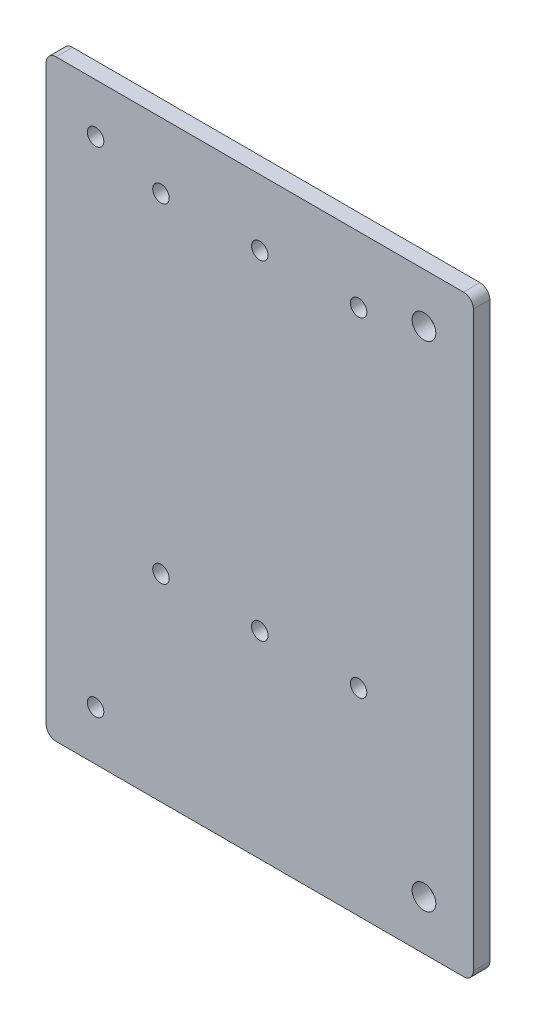
ISO-10303-21;
HEADER;
FILE_DESCRIPTION(('STEP AP214'),'2;1');
FILE_NAME('part.step','',(''),(''),'','','');
FILE_SCHEMA(('AUTOMOTIVE_DESIGN { 1 0 10303 214 1 1 1 1 }'));
ENDSEC;
DATA;
#1=APPLICATION_CONTEXT('core data for automotive mechanical design processes');
#2=APPLICATION_PROTOCOL_DEFINITION('international standard','automotive_design',2000,#1);
#3=PRODUCT_CONTEXT('',#1,'mechanical');
#4=PRODUCT('Part','Part','',(#3));
#5=PRODUCT_RELATED_PRODUCT_CATEGORY('part','',(#4));
#6=PRODUCT_DEFINITION_FORMATION('','',#4);
#7=PRODUCT_DEFINITION_CONTEXT('part definition',#1,'design');
#8=PRODUCT_DEFINITION('design','',#6,#7);
#9=PRODUCT_DEFINITION_SHAPE('','',#8);
#10=(LENGTH_UNIT() NAMED_UNIT(*) SI_UNIT(.MILLI.,.METRE.));
#11=(NAMED_UNIT(*) PLANE_ANGLE_UNIT() SI_UNIT($,.RADIAN.));
#12=(NAMED_UNIT(*) SI_UNIT($,.STERADIAN.) SOLID_ANGLE_UNIT());
#13=UNCERTAINTY_MEASURE_WITH_UNIT(LENGTH_MEASURE(1.E-05),#10,'distance_accuracy_value','');
#14=(GEOMETRIC_REPRESENTATION_CONTEXT(3) GLOBAL_UNCERTAINTY_ASSIGNED_CONTEXT((#13)) GLOBAL_UNIT_ASSIGNED_CONTEXT((#10,
#11,#12)) REPRESENTATION_CONTEXT('',''));
#15=CARTESIAN_POINT('',(0.,0.,0.));
#16=DIRECTION('',(0.,0.,1.));
#17=DIRECTION('',(1.,0.,0.));
#18=AXIS2_PLACEMENT_3D('',#15,#16,#17);
#19=CARTESIAN_POINT('',(0.,0.,5.));
#20=DIRECTION('',(0.,0.,-1.));
#21=DIRECTION('',(-1.,0.,0.));
#22=AXIS2_PLACEMENT_3D('',#19,#20,#21);
#23=PLANE('',#22);
#24=DIRECTION('',(0.,-1.,0.));
#25=VECTOR('',#24,1.);
#26=CARTESIAN_POINT('',(0.,0.,5.));
#27=LINE('',#26,#25);
#28=CARTESIAN_POINT('',(0.,177.,5.));
#29=VERTEX_POINT('',#28);
#30=CARTESIAN_POINT('',(0.,3.,5.));
#31=VERTEX_POINT('',#30);
#32=EDGE_CURVE('E137',#29,#31,#27,.T.);
#33=ORIENTED_EDGE('',*,*,#32,.T.);
#34=CARTESIAN_POINT('',(3.,3.,5.));
#35=DIRECTION('',(0.,0.,-1.));
#36=DIRECTION('',(-1.,0.,0.));
#37=AXIS2_PLACEMENT_3D('',#34,#35,#36);
#38=CIRCLE('',#37,3.);
#39=CARTESIAN_POINT('',(3.,0.,5.));
#40=VERTEX_POINT('',#39);
#41=EDGE_CURVE('E152',#31,#40,#38,.F.);
#42=ORIENTED_EDGE('',*,*,#41,.T.);
#43=DIRECTION('',(1.,0.,0.));
#44=VECTOR('',#43,1.);
#45=CARTESIAN_POINT('',(0.,0.,5.));
#46=LINE('',#45,#44);
#47=CARTESIAN_POINT('',(126.7,0.,5.));
#48=VERTEX_POINT('',#47);
#49=EDGE_CURVE('E119',#40,#48,#46,.T.);
#50=ORIENTED_EDGE('',*,*,#49,.T.);
#51=CARTESIAN_POINT('',(126.7,3.,5.));
#52=DIRECTION('',(0.,0.,-1.));
#53=DIRECTION('',(-1.,0.,0.));
#54=AXIS2_PLACEMENT_3D('',#51,#52,#53);
#55=CIRCLE('',#54,3.);
#56=CARTESIAN_POINT('',(129.7,3.,5.));
#57=VERTEX_POINT('',#56);
#58=EDGE_CURVE('E150',#48,#57,#55,.F.);
#59=ORIENTED_EDGE('',*,*,#58,.T.);
#60=DIRECTION('',(0.,1.,0.));
#61=VECTOR('',#60,1.);
#62=CARTESIAN_POINT('',(129.7,0.,5.));
#63=LINE('',#62,#61);
#64=CARTESIAN_POINT('',(129.7,177.,5.));
#65=VERTEX_POINT('',#64);
#66=EDGE_CURVE('E172',#57,#65,#63,.T.);
#67=ORIENTED_EDGE('',*,*,#66,.T.);
#68=CARTESIAN_POINT('',(126.7,177.,5.));
#69=DIRECTION('',(0.,0.,-1.));
#70=DIRECTION('',(-1.,0.,0.));
#71=AXIS2_PLACEMENT_3D('',#68,#69,#70);
#72=CIRCLE('',#71,3.);
#73=CARTESIAN_POINT('',(126.7,180.,5.));
#74=VERTEX_POINT('',#73);
#75=EDGE_CURVE('E54',#65,#74,#72,.F.);
#76=ORIENTED_EDGE('',*,*,#75,.T.);
#77=DIRECTION('',(-1.,0.,0.));
#78=VECTOR('',#77,1.);
#79=CARTESIAN_POINT('',(0.,180.,5.));
#80=LINE('',#79,#78);
#81=CARTESIAN_POINT('',(3.,180.,5.));
#82=VERTEX_POINT('',#81);
#83=EDGE_CURVE('E138',#74,#82,#80,.T.);
#84=ORIENTED_EDGE('',*,*,#83,.T.);
#85=CARTESIAN_POINT('',(3.,177.,5.));
#86=DIRECTION('',(0.,0.,-1.));
#87=DIRECTION('',(-1.,0.,0.));
#88=AXIS2_PLACEMENT_3D('',#85,#86,#87);
#89=CIRCLE('',#88,3.);
#90=EDGE_CURVE('E148',#82,#29,#89,.F.);
#91=ORIENTED_EDGE('',*,*,#90,.T.);
#92=EDGE_LOOP('',(#33,#42,#50,#59,#67,#76,#84,#91));
#93=FACE_BOUND('',#92,.T.);
#94=CARTESIAN_POINT('',(15.,15.,5.));
#95=DIRECTION('',(0.,0.,1.));
#96=DIRECTION('',(1.,0.,0.));
#97=AXIS2_PLACEMENT_3D('',#94,#95,#96);
#98=CIRCLE('',#97,2.5);
#99=CARTESIAN_POINT('',(17.5,15.,5.));
#100=VERTEX_POINT('',#99);
#101=EDGE_CURVE('E132',#100,#100,#98,.T.);
#102=ORIENTED_EDGE('',*,*,#101,.F.);
#103=EDGE_LOOP('',(#102));
#104=FACE_BOUND('',#103,.T.);
#105=CARTESIAN_POINT('',(15.,165.,5.));
#106=DIRECTION('',(0.,0.,1.));
#107=DIRECTION('',(1.,0.,0.));
#108=AXIS2_PLACEMENT_3D('',#105,#106,#107);
#109=CIRCLE('',#108,2.5);
#110=CARTESIAN_POINT('',(17.5,165.,5.));
#111=VERTEX_POINT('',#110);
#112=EDGE_CURVE('E187',#111,#111,#109,.T.);
#113=ORIENTED_EDGE('',*,*,#112,.F.);
#114=EDGE_LOOP('',(#113));
#115=FACE_BOUND('',#114,.T.);
#116=CARTESIAN_POINT('',(114.7,165.,5.));
#117=DIRECTION('',(0.,0.,1.));
#118=DIRECTION('',(1.,0.,0.));
#119=AXIS2_PLACEMENT_3D('',#116,#117,#118);
#120=CIRCLE('',#119,3.59999999999997);
#121=CARTESIAN_POINT('',(118.3,165.,5.));
#122=VERTEX_POINT('',#121);
#123=EDGE_CURVE('E191',#122,#122,#120,.T.);
#124=ORIENTED_EDGE('',*,*,#123,.F.);
#125=EDGE_LOOP('',(#124));
#126=FACE_BOUND('',#125,.T.);
#127=CARTESIAN_POINT('',(114.7,15.,5.));
#128=DIRECTION('',(0.,0.,1.));
#129=DIRECTION('',(1.,0.,0.));
#130=AXIS2_PLACEMENT_3D('',#127,#128,#129);
#131=CIRCLE('',#130,3.6);
#132=CARTESIAN_POINT('',(118.3,15.,5.));
#133=VERTEX_POINT('',#132);
#134=EDGE_CURVE('E195',#133,#133,#131,.T.);
#135=ORIENTED_EDGE('',*,*,#134,.F.);
#136=EDGE_LOOP('',(#135));
#137=FACE_BOUND('',#136,.T.);
#138=CARTESIAN_POINT('',(34.85,160.,5.));
#139=DIRECTION('',(0.,0.,1.));
#140=DIRECTION('',(1.,0.,0.));
#141=AXIS2_PLACEMENT_3D('',#138,#139,#140);
#142=CIRCLE('',#141,2.5);
#143=CARTESIAN_POINT('',(37.35,160.,5.));
#144=VERTEX_POINT('',#143);
#145=EDGE_CURVE('E199',#144,#144,#142,.T.);
#146=ORIENTED_EDGE('',*,*,#145,.F.);
#147=EDGE_LOOP('',(#146));
#148=FACE_BOUND('',#147,.T.);
#149=CARTESIAN_POINT('',(64.85,160.,5.));
#150=DIRECTION('',(0.,0.,1.));
#151=DIRECTION('',(1.,0.,0.));
#152=AXIS2_PLACEMENT_3D('',#149,#150,#151);
#153=CIRCLE('',#152,2.5);
#154=CARTESIAN_POINT('',(67.35,160.,5.));
#155=VERTEX_POINT('',#154);
#156=EDGE_CURVE('E203',#155,#155,#153,.T.);
#157=ORIENTED_EDGE('',*,*,#156,.F.);
#158=EDGE_LOOP('',(#157));
#159=FACE_BOUND('',#158,.T.);
#160=CARTESIAN_POINT('',(94.85,160.,5.));
#161=DIRECTION('',(0.,0.,1.));
#162=DIRECTION('',(1.,0.,0.));
#163=AXIS2_PLACEMENT_3D('',#160,#161,#162);
#164=CIRCLE('',#163,2.5);
#165=CARTESIAN_POINT('',(97.35,160.,5.));
#166=VERTEX_POINT('',#165);
#167=EDGE_CURVE('E207',#166,#166,#164,.T.);
#168=ORIENTED_EDGE('',*,*,#167,.F.);
#169=EDGE_LOOP('',(#168));
#170=FACE_BOUND('',#169,.T.);
#171=CARTESIAN_POINT('',(34.85,60.,5.));
#172=DIRECTION('',(0.,0.,1.));
#173=DIRECTION('',(1.,0.,0.));
#174=AXIS2_PLACEMENT_3D('',#171,#172,#173);
#175=CIRCLE('',#174,2.5);
#176=CARTESIAN_POINT('',(37.35,60.,5.));
#177=VERTEX_POINT('',#176);
#178=EDGE_CURVE('E211',#177,#177,#175,.T.);
#179=ORIENTED_EDGE('',*,*,#178,.F.);
#180=EDGE_LOOP('',(#179));
#181=FACE_BOUND('',#180,.T.);
#182=CARTESIAN_POINT('',(64.85,60.,5.));
#183=DIRECTION('',(0.,0.,1.));
#184=DIRECTION('',(1.,0.,0.));
#185=AXIS2_PLACEMENT_3D('',#182,#183,#184);
#186=CIRCLE('',#185,2.5);
#187=CARTESIAN_POINT('',(67.35,60.,5.));
#188=VERTEX_POINT('',#187);
#189=EDGE_CURVE('E215',#188,#188,#186,.T.);
#190=ORIENTED_EDGE('',*,*,#189,.F.);
#191=EDGE_LOOP('',(#190));
#192=FACE_BOUND('',#191,.T.);
#193=CARTESIAN_POINT('',(94.85,60.,5.));
#194=DIRECTION('',(0.,0.,1.));
#195=DIRECTION('',(1.,0.,0.));
#196=AXIS2_PLACEMENT_3D('',#193,#194,#195);
#197=CIRCLE('',#196,2.5);
#198=CARTESIAN_POINT('',(97.35,60.,5.));
#199=VERTEX_POINT('',#198);
#200=EDGE_CURVE('E218',#199,#199,#197,.T.);
#201=ORIENTED_EDGE('',*,*,#200,.F.);
#202=EDGE_LOOP('',(#201));
#203=FACE_BOUND('',#202,.T.);
#204=ADVANCED_FACE('F34',(#93,#104,#115,#126,#137,#148,#159,#170,#181,#192,#203),#23,.F.);
#205=CARTESIAN_POINT('',(0.,0.,0.));
#206=DIRECTION('',(0.,0.,-1.));
#207=DIRECTION('',(-1.,0.,0.));
#208=AXIS2_PLACEMENT_3D('',#205,#206,#207);
#209=PLANE('',#208);
#210=CARTESIAN_POINT('',(64.85,60.,0.));
#211=DIRECTION('',(0.,0.,1.));
#212=DIRECTION('',(1.,0.,0.));
#213=AXIS2_PLACEMENT_3D('',#210,#211,#212);
#214=CIRCLE('',#213,2.5);
#215=CARTESIAN_POINT('',(67.35,60.,0.));
#216=VERTEX_POINT('',#215);
#217=EDGE_CURVE('E220',#216,#216,#214,.T.);
#218=ORIENTED_EDGE('',*,*,#217,.T.);
#219=EDGE_LOOP('',(#218));
#220=FACE_BOUND('',#219,.T.);
#221=CARTESIAN_POINT('',(94.85,160.,0.));
#222=DIRECTION('',(0.,0.,1.));
#223=DIRECTION('',(1.,0.,0.));
#224=AXIS2_PLACEMENT_3D('',#221,#222,#223);
#225=CIRCLE('',#224,2.5);
#226=CARTESIAN_POINT('',(97.35,160.,0.));
#227=VERTEX_POINT('',#226);
#228=EDGE_CURVE('E231',#227,#227,#225,.T.);
#229=ORIENTED_EDGE('',*,*,#228,.T.);
#230=EDGE_LOOP('',(#229));
#231=FACE_BOUND('',#230,.T.);
#232=CARTESIAN_POINT('',(34.85,160.,0.));
#233=DIRECTION('',(0.,0.,1.));
#234=DIRECTION('',(1.,0.,0.));
#235=AXIS2_PLACEMENT_3D('',#232,#233,#234);
#236=CIRCLE('',#235,2.5);
#237=CARTESIAN_POINT('',(37.35,160.,0.));
#238=VERTEX_POINT('',#237);
#239=EDGE_CURVE('E239',#238,#238,#236,.T.);
#240=ORIENTED_EDGE('',*,*,#239,.T.);
#241=EDGE_LOOP('',(#240));
#242=FACE_BOUND('',#241,.T.);
#243=CARTESIAN_POINT('',(114.7,165.,0.));
#244=DIRECTION('',(0.,0.,1.));
#245=DIRECTION('',(1.,0.,0.));
#246=AXIS2_PLACEMENT_3D('',#243,#244,#245);
#247=CIRCLE('',#246,3.59999999999997);
#248=CARTESIAN_POINT('',(118.3,165.,0.));
#249=VERTEX_POINT('',#248);
#250=EDGE_CURVE('E247',#249,#249,#247,.T.);
#251=ORIENTED_EDGE('',*,*,#250,.T.);
#252=EDGE_LOOP('',(#251));
#253=FACE_BOUND('',#252,.T.);
#254=CARTESIAN_POINT('',(15.,15.,0.));
#255=DIRECTION('',(0.,0.,1.));
#256=DIRECTION('',(1.,0.,0.));
#257=AXIS2_PLACEMENT_3D('',#254,#255,#256);
#258=CIRCLE('',#257,2.5);
#259=CARTESIAN_POINT('',(17.5,15.,0.));
#260=VERTEX_POINT('',#259);
#261=EDGE_CURVE('E175',#260,#260,#258,.T.);
#262=ORIENTED_EDGE('',*,*,#261,.T.);
#263=EDGE_LOOP('',(#262));
#264=FACE_BOUND('',#263,.T.);
#265=DIRECTION('',(1.,0.,0.));
#266=VECTOR('',#265,1.);
#267=CARTESIAN_POINT('',(0.,0.,0.));
#268=LINE('',#267,#266);
#269=CARTESIAN_POINT('',(3.,0.,0.));
#270=VERTEX_POINT('',#269);
#271=CARTESIAN_POINT('',(126.7,0.,0.));
#272=VERTEX_POINT('',#271);
#273=EDGE_CURVE('E116',#270,#272,#268,.T.);
#274=ORIENTED_EDGE('',*,*,#273,.F.);
#275=CARTESIAN_POINT('',(3.,3.,0.));
#276=DIRECTION('',(0.,0.,-1.));
#277=DIRECTION('',(-1.,0.,0.));
#278=AXIS2_PLACEMENT_3D('',#275,#276,#277);
#279=CIRCLE('',#278,3.);
#280=CARTESIAN_POINT('',(0.,3.,0.));
#281=VERTEX_POINT('',#280);
#282=EDGE_CURVE('E99',#270,#281,#279,.T.);
#283=ORIENTED_EDGE('',*,*,#282,.T.);
#284=DIRECTION('',(0.,-1.,0.));
#285=VECTOR('',#284,1.);
#286=CARTESIAN_POINT('',(0.,0.,0.));
#287=LINE('',#286,#285);
#288=CARTESIAN_POINT('',(0.,177.,0.));
#289=VERTEX_POINT('',#288);
#290=EDGE_CURVE('E127',#289,#281,#287,.T.);
#291=ORIENTED_EDGE('',*,*,#290,.F.);
#292=CARTESIAN_POINT('',(3.,177.,0.));
#293=DIRECTION('',(0.,0.,-1.));
#294=DIRECTION('',(-1.,0.,0.));
#295=AXIS2_PLACEMENT_3D('',#292,#293,#294);
#296=CIRCLE('',#295,3.);
#297=CARTESIAN_POINT('',(3.,180.,0.));
#298=VERTEX_POINT('',#297);
#299=EDGE_CURVE('E141',#289,#298,#296,.T.);
#300=ORIENTED_EDGE('',*,*,#299,.T.);
#301=DIRECTION('',(-1.,0.,0.));
#302=VECTOR('',#301,1.);
#303=CARTESIAN_POINT('',(0.,180.,0.));
#304=LINE('',#303,#302);
#305=CARTESIAN_POINT('',(126.7,180.,0.));
#306=VERTEX_POINT('',#305);
#307=EDGE_CURVE('E130',#306,#298,#304,.T.);
#308=ORIENTED_EDGE('',*,*,#307,.F.);
#309=CARTESIAN_POINT('',(126.7,177.,0.));
#310=DIRECTION('',(0.,0.,-1.));
#311=DIRECTION('',(-1.,0.,0.));
#312=AXIS2_PLACEMENT_3D('',#309,#310,#311);
#313=CIRCLE('',#312,3.);
#314=CARTESIAN_POINT('',(129.7,177.,0.));
#315=VERTEX_POINT('',#314);
#316=EDGE_CURVE('E120',#306,#315,#313,.T.);
#317=ORIENTED_EDGE('',*,*,#316,.T.);
#318=DIRECTION('',(0.,1.,0.));
#319=VECTOR('',#318,1.);
#320=CARTESIAN_POINT('',(129.7,0.,0.));
#321=LINE('',#320,#319);
#322=CARTESIAN_POINT('',(129.7,3.,0.));
#323=VERTEX_POINT('',#322);
#324=EDGE_CURVE('E126',#323,#315,#321,.T.);
#325=ORIENTED_EDGE('',*,*,#324,.F.);
#326=CARTESIAN_POINT('',(126.7,3.,0.));
#327=DIRECTION('',(0.,0.,-1.));
#328=DIRECTION('',(-1.,0.,0.));
#329=AXIS2_PLACEMENT_3D('',#326,#327,#328);
#330=CIRCLE('',#329,3.);
#331=EDGE_CURVE('E110',#323,#272,#330,.T.);
#332=ORIENTED_EDGE('',*,*,#331,.T.);
#333=EDGE_LOOP('',(#274,#283,#291,#300,#308,#317,#325,#332));
#334=FACE_BOUND('',#333,.T.);
#335=CARTESIAN_POINT('',(15.,165.,0.));
#336=DIRECTION('',(0.,0.,1.));
#337=DIRECTION('',(1.,0.,0.));
#338=AXIS2_PLACEMENT_3D('',#335,#336,#337);
#339=CIRCLE('',#338,2.5);
#340=CARTESIAN_POINT('',(17.5,165.,0.));
#341=VERTEX_POINT('',#340);
#342=EDGE_CURVE('E251',#341,#341,#339,.T.);
#343=ORIENTED_EDGE('',*,*,#342,.T.);
#344=EDGE_LOOP('',(#343));
#345=FACE_BOUND('',#344,.T.);
#346=CARTESIAN_POINT('',(114.7,15.,0.));
#347=DIRECTION('',(0.,0.,1.));
#348=DIRECTION('',(1.,0.,0.));
#349=AXIS2_PLACEMENT_3D('',#346,#347,#348);
#350=CIRCLE('',#349,3.6);
#351=CARTESIAN_POINT('',(118.3,15.,0.));
#352=VERTEX_POINT('',#351);
#353=EDGE_CURVE('E243',#352,#352,#350,.T.);
#354=ORIENTED_EDGE('',*,*,#353,.T.);
#355=EDGE_LOOP('',(#354));
#356=FACE_BOUND('',#355,.T.);
#357=CARTESIAN_POINT('',(64.85,160.,0.));
#358=DIRECTION('',(0.,0.,1.));
#359=DIRECTION('',(1.,0.,0.));
#360=AXIS2_PLACEMENT_3D('',#357,#358,#359);
#361=CIRCLE('',#360,2.5);
#362=CARTESIAN_POINT('',(67.35,160.,0.));
#363=VERTEX_POINT('',#362);
#364=EDGE_CURVE('E235',#363,#363,#361,.T.);
#365=ORIENTED_EDGE('',*,*,#364,.T.);
#366=EDGE_LOOP('',(#365));
#367=FACE_BOUND('',#366,.T.);
#368=CARTESIAN_POINT('',(34.85,60.,0.));
#369=DIRECTION('',(0.,0.,1.));
#370=DIRECTION('',(1.,0.,0.));
#371=AXIS2_PLACEMENT_3D('',#368,#369,#370);
#372=CIRCLE('',#371,2.5);
#373=CARTESIAN_POINT('',(37.35,60.,0.));
#374=VERTEX_POINT('',#373);
#375=EDGE_CURVE('E228',#374,#374,#372,.T.);
#376=ORIENTED_EDGE('',*,*,#375,.T.);
#377=EDGE_LOOP('',(#376));
#378=FACE_BOUND('',#377,.T.);
#379=CARTESIAN_POINT('',(94.85,60.,0.));
#380=DIRECTION('',(0.,0.,1.));
#381=DIRECTION('',(1.,0.,0.));
#382=AXIS2_PLACEMENT_3D('',#379,#380,#381);
#383=CIRCLE('',#382,2.5);
#384=CARTESIAN_POINT('',(97.35,60.,0.));
#385=VERTEX_POINT('',#384);
#386=EDGE_CURVE('E221',#385,#385,#383,.T.);
#387=ORIENTED_EDGE('',*,*,#386,.T.);
#388=EDGE_LOOP('',(#387));
#389=FACE_BOUND('',#388,.T.);
#390=ADVANCED_FACE('F123',(#220,#231,#242,#253,#264,#334,#345,#356,#367,#378,#389),#209,.T.);
#391=CARTESIAN_POINT('',(0.,0.,5.));
#392=DIRECTION('',(1.,0.,0.));
#393=DIRECTION('',(0.,0.,-1.));
#394=AXIS2_PLACEMENT_3D('',#391,#392,#393);
#395=PLANE('',#394);
#396=ORIENTED_EDGE('',*,*,#290,.T.);
#397=DIRECTION('',(0.,0.,-1.));
#398=VECTOR('',#397,1.);
#399=CARTESIAN_POINT('',(0.,3.,5.));
#400=LINE('',#399,#398);
#401=EDGE_CURVE('E104',#281,#31,#400,.F.);
#402=ORIENTED_EDGE('',*,*,#401,.T.);
#403=ORIENTED_EDGE('',*,*,#32,.F.);
#404=DIRECTION('',(0.,0.,-1.));
#405=VECTOR('',#404,1.);
#406=CARTESIAN_POINT('',(0.,177.,5.));
#407=LINE('',#406,#405);
#408=EDGE_CURVE('E109',#29,#289,#407,.T.);
#409=ORIENTED_EDGE('',*,*,#408,.T.);
#410=EDGE_LOOP('',(#396,#402,#403,#409));
#411=FACE_BOUND('',#410,.T.);
#412=ADVANCED_FACE('F169',(#411),#395,.F.);
#413=CARTESIAN_POINT('',(0.,0.,5.));
#414=DIRECTION('',(0.,1.,0.));
#415=DIRECTION('',(0.,0.,1.));
#416=AXIS2_PLACEMENT_3D('',#413,#414,#415);
#417=PLANE('',#416);
#418=ORIENTED_EDGE('',*,*,#49,.F.);
#419=DIRECTION('',(0.,0.,-1.));
#420=VECTOR('',#419,1.);
#421=CARTESIAN_POINT('',(3.,0.,5.));
#422=LINE('',#421,#420);
#423=EDGE_CURVE('E103',#40,#270,#422,.T.);
#424=ORIENTED_EDGE('',*,*,#423,.T.);
#425=ORIENTED_EDGE('',*,*,#273,.T.);
#426=DIRECTION('',(0.,0.,-1.));
#427=VECTOR('',#426,1.);
#428=CARTESIAN_POINT('',(126.7,0.,5.));
#429=LINE('',#428,#427);
#430=EDGE_CURVE('E121',#272,#48,#429,.F.);
#431=ORIENTED_EDGE('',*,*,#430,.T.);
#432=EDGE_LOOP('',(#418,#424,#425,#431));
#433=FACE_BOUND('',#432,.T.);
#434=ADVANCED_FACE('F115',(#433),#417,.F.);
#435=CARTESIAN_POINT('',(129.7,0.,5.));
#436=DIRECTION('',(-1.,0.,0.));
#437=DIRECTION('',(0.,0.,1.));
#438=AXIS2_PLACEMENT_3D('',#435,#436,#437);
#439=PLANE('',#438);
#440=ORIENTED_EDGE('',*,*,#66,.F.);
#441=DIRECTION('',(0.,0.,-1.));
#442=VECTOR('',#441,1.);
#443=CARTESIAN_POINT('',(129.7,3.,5.));
#444=LINE('',#443,#442);
#445=EDGE_CURVE('E156',#57,#323,#444,.T.);
#446=ORIENTED_EDGE('',*,*,#445,.T.);
#447=ORIENTED_EDGE('',*,*,#324,.T.);
#448=DIRECTION('',(0.,0.,-1.));
#449=VECTOR('',#448,1.);
#450=CARTESIAN_POINT('',(129.7,177.,5.));
#451=LINE('',#450,#449);
#452=EDGE_CURVE('E154',#315,#65,#451,.F.);
#453=ORIENTED_EDGE('',*,*,#452,.T.);
#454=EDGE_LOOP('',(#440,#446,#447,#453));
#455=FACE_BOUND('',#454,.T.);
#456=ADVANCED_FACE('F272',(#455),#439,.F.);
#457=CARTESIAN_POINT('',(0.,180.,5.));
#458=DIRECTION('',(0.,-1.,0.));
#459=DIRECTION('',(0.,0.,-1.));
#460=AXIS2_PLACEMENT_3D('',#457,#458,#459);
#461=PLANE('',#460);
#462=ORIENTED_EDGE('',*,*,#307,.T.);
#463=DIRECTION('',(0.,0.,-1.));
#464=VECTOR('',#463,1.);
#465=CARTESIAN_POINT('',(3.,180.,5.));
#466=LINE('',#465,#464);
#467=EDGE_CURVE('E11',#298,#82,#466,.F.);
#468=ORIENTED_EDGE('',*,*,#467,.T.);
#469=ORIENTED_EDGE('',*,*,#83,.F.);
#470=DIRECTION('',(0.,0.,-1.));
#471=VECTOR('',#470,1.);
#472=CARTESIAN_POINT('',(126.7,180.,5.));
#473=LINE('',#472,#471);
#474=EDGE_CURVE('E42',#74,#306,#473,.T.);
#475=ORIENTED_EDGE('',*,*,#474,.T.);
#476=EDGE_LOOP('',(#462,#468,#469,#475));
#477=FACE_BOUND('',#476,.T.);
#478=ADVANCED_FACE('F161',(#477),#461,.F.);
#479=CARTESIAN_POINT('',(15.,15.,5.));
#480=DIRECTION('',(0.,0.,-1.));
#481=DIRECTION('',(-1.,0.,0.));
#482=AXIS2_PLACEMENT_3D('',#479,#480,#481);
#483=CYLINDRICAL_SURFACE('',#482,2.5);
#484=ORIENTED_EDGE('',*,*,#101,.T.);
#485=EDGE_LOOP('',(#484));
#486=FACE_BOUND('',#485,.T.);
#487=ORIENTED_EDGE('',*,*,#261,.F.);
#488=EDGE_LOOP('',(#487));
#489=FACE_BOUND('',#488,.T.);
#490=ADVANCED_FACE('F261',(#486,#489),#483,.F.);
#491=CARTESIAN_POINT('',(15.,165.,5.));
#492=DIRECTION('',(0.,0.,-1.));
#493=DIRECTION('',(-1.,0.,0.));
#494=AXIS2_PLACEMENT_3D('',#491,#492,#493);
#495=CYLINDRICAL_SURFACE('',#494,2.5);
#496=ORIENTED_EDGE('',*,*,#112,.T.);
#497=EDGE_LOOP('',(#496));
#498=FACE_BOUND('',#497,.T.);
#499=ORIENTED_EDGE('',*,*,#342,.F.);
#500=EDGE_LOOP('',(#499));
#501=FACE_BOUND('',#500,.T.);
#502=ADVANCED_FACE('F263',(#498,#501),#495,.F.);
#503=CARTESIAN_POINT('',(114.7,165.,5.));
#504=DIRECTION('',(0.,0.,-1.));
#505=DIRECTION('',(-1.,0.,0.));
#506=AXIS2_PLACEMENT_3D('',#503,#504,#505);
#507=CYLINDRICAL_SURFACE('',#506,3.59999999999997);
#508=ORIENTED_EDGE('',*,*,#123,.T.);
#509=EDGE_LOOP('',(#508));
#510=FACE_BOUND('',#509,.T.);
#511=ORIENTED_EDGE('',*,*,#250,.F.);
#512=EDGE_LOOP('',(#511));
#513=FACE_BOUND('',#512,.T.);
#514=ADVANCED_FACE('F269',(#510,#513),#507,.F.);
#515=CARTESIAN_POINT('',(114.7,15.,5.));
#516=DIRECTION('',(0.,0.,-1.));
#517=DIRECTION('',(-1.,0.,0.));
#518=AXIS2_PLACEMENT_3D('',#515,#516,#517);
#519=CYLINDRICAL_SURFACE('',#518,3.6);
#520=ORIENTED_EDGE('',*,*,#134,.T.);
#521=EDGE_LOOP('',(#520));
#522=FACE_BOUND('',#521,.T.);
#523=ORIENTED_EDGE('',*,*,#353,.F.);
#524=EDGE_LOOP('',(#523));
#525=FACE_BOUND('',#524,.T.);
#526=ADVANCED_FACE('F413',(#522,#525),#519,.F.);
#527=CARTESIAN_POINT('',(34.85,160.,5.));
#528=DIRECTION('',(0.,0.,-1.));
#529=DIRECTION('',(-1.,0.,0.));
#530=AXIS2_PLACEMENT_3D('',#527,#528,#529);
#531=CYLINDRICAL_SURFACE('',#530,2.5);
#532=ORIENTED_EDGE('',*,*,#145,.T.);
#533=EDGE_LOOP('',(#532));
#534=FACE_BOUND('',#533,.T.);
#535=ORIENTED_EDGE('',*,*,#239,.F.);
#536=EDGE_LOOP('',(#535));
#537=FACE_BOUND('',#536,.T.);
#538=ADVANCED_FACE('F403',(#534,#537),#531,.F.);
#539=CARTESIAN_POINT('',(64.85,160.,5.));
#540=DIRECTION('',(0.,0.,-1.));
#541=DIRECTION('',(-1.,0.,0.));
#542=AXIS2_PLACEMENT_3D('',#539,#540,#541);
#543=CYLINDRICAL_SURFACE('',#542,2.5);
#544=ORIENTED_EDGE('',*,*,#156,.T.);
#545=EDGE_LOOP('',(#544));
#546=FACE_BOUND('',#545,.T.);
#547=ORIENTED_EDGE('',*,*,#364,.F.);
#548=EDGE_LOOP('',(#547));
#549=FACE_BOUND('',#548,.T.);
#550=ADVANCED_FACE('F393',(#546,#549),#543,.F.);
#551=CARTESIAN_POINT('',(94.85,160.,5.));
#552=DIRECTION('',(0.,0.,-1.));
#553=DIRECTION('',(-1.,0.,0.));
#554=AXIS2_PLACEMENT_3D('',#551,#552,#553);
#555=CYLINDRICAL_SURFACE('',#554,2.5);
#556=ORIENTED_EDGE('',*,*,#167,.T.);
#557=EDGE_LOOP('',(#556));
#558=FACE_BOUND('',#557,.T.);
#559=ORIENTED_EDGE('',*,*,#228,.F.);
#560=EDGE_LOOP('',(#559));
#561=FACE_BOUND('',#560,.T.);
#562=ADVANCED_FACE('F383',(#558,#561),#555,.F.);
#563=CARTESIAN_POINT('',(34.85,60.,5.));
#564=DIRECTION('',(0.,0.,-1.));
#565=DIRECTION('',(-1.,0.,0.));
#566=AXIS2_PLACEMENT_3D('',#563,#564,#565);
#567=CYLINDRICAL_SURFACE('',#566,2.5);
#568=ORIENTED_EDGE('',*,*,#178,.T.);
#569=EDGE_LOOP('',(#568));
#570=FACE_BOUND('',#569,.T.);
#571=ORIENTED_EDGE('',*,*,#375,.F.);
#572=EDGE_LOOP('',(#571));
#573=FACE_BOUND('',#572,.T.);
#574=ADVANCED_FACE('F373',(#570,#573),#567,.F.);
#575=CARTESIAN_POINT('',(64.85,60.,5.));
#576=DIRECTION('',(0.,0.,-1.));
#577=DIRECTION('',(-1.,0.,0.));
#578=AXIS2_PLACEMENT_3D('',#575,#576,#577);
#579=CYLINDRICAL_SURFACE('',#578,2.5);
#580=ORIENTED_EDGE('',*,*,#189,.T.);
#581=EDGE_LOOP('',(#580));
#582=FACE_BOUND('',#581,.T.);
#583=ORIENTED_EDGE('',*,*,#217,.F.);
#584=EDGE_LOOP('',(#583));
#585=FACE_BOUND('',#584,.T.);
#586=ADVANCED_FACE('F364',(#582,#585),#579,.F.);
#587=CARTESIAN_POINT('',(94.85,60.,5.));
#588=DIRECTION('',(0.,0.,-1.));
#589=DIRECTION('',(-1.,0.,0.));
#590=AXIS2_PLACEMENT_3D('',#587,#588,#589);
#591=CYLINDRICAL_SURFACE('',#590,2.5);
#592=ORIENTED_EDGE('',*,*,#200,.T.);
#593=EDGE_LOOP('',(#592));
#594=FACE_BOUND('',#593,.T.);
#595=ORIENTED_EDGE('',*,*,#386,.F.);
#596=EDGE_LOOP('',(#595));
#597=FACE_BOUND('',#596,.T.);
#598=ADVANCED_FACE('F289',(#594,#597),#591,.F.);
#599=CARTESIAN_POINT('',(3.,3.,5.));
#600=DIRECTION('',(0.,0.,-1.));
#601=DIRECTION('',(-1.,0.,0.));
#602=AXIS2_PLACEMENT_3D('',#599,#600,#601);
#603=CYLINDRICAL_SURFACE('',#602,3.);
#604=ORIENTED_EDGE('',*,*,#41,.F.);
#605=ORIENTED_EDGE('',*,*,#401,.F.);
#606=ORIENTED_EDGE('',*,*,#282,.F.);
#607=ORIENTED_EDGE('',*,*,#423,.F.);
#608=EDGE_LOOP('',(#604,#605,#606,#607));
#609=FACE_BOUND('',#608,.T.);
#610=ADVANCED_FACE('F102',(#609),#603,.T.);
#611=CARTESIAN_POINT('',(126.7,3.,5.));
#612=DIRECTION('',(0.,0.,-1.));
#613=DIRECTION('',(-1.,0.,0.));
#614=AXIS2_PLACEMENT_3D('',#611,#612,#613);
#615=CYLINDRICAL_SURFACE('',#614,3.);
#616=ORIENTED_EDGE('',*,*,#58,.F.);
#617=ORIENTED_EDGE('',*,*,#430,.F.);
#618=ORIENTED_EDGE('',*,*,#331,.F.);
#619=ORIENTED_EDGE('',*,*,#445,.F.);
#620=EDGE_LOOP('',(#616,#617,#618,#619));
#621=FACE_BOUND('',#620,.T.);
#622=ADVANCED_FACE('F288',(#621),#615,.T.);
#623=CARTESIAN_POINT('',(3.,177.,5.));
#624=DIRECTION('',(0.,0.,-1.));
#625=DIRECTION('',(-1.,0.,0.));
#626=AXIS2_PLACEMENT_3D('',#623,#624,#625);
#627=CYLINDRICAL_SURFACE('',#626,3.);
#628=ORIENTED_EDGE('',*,*,#90,.F.);
#629=ORIENTED_EDGE('',*,*,#467,.F.);
#630=ORIENTED_EDGE('',*,*,#299,.F.);
#631=ORIENTED_EDGE('',*,*,#408,.F.);
#632=EDGE_LOOP('',(#628,#629,#630,#631));
#633=FACE_BOUND('',#632,.T.);
#634=ADVANCED_FACE('F166',(#633),#627,.T.);
#635=CARTESIAN_POINT('',(126.7,177.,5.));
#636=DIRECTION('',(0.,0.,-1.));
#637=DIRECTION('',(-1.,0.,0.));
#638=AXIS2_PLACEMENT_3D('',#635,#636,#637);
#639=CYLINDRICAL_SURFACE('',#638,3.);
#640=ORIENTED_EDGE('',*,*,#75,.F.);
#641=ORIENTED_EDGE('',*,*,#452,.F.);
#642=ORIENTED_EDGE('',*,*,#316,.F.);
#643=ORIENTED_EDGE('',*,*,#474,.F.);
#644=EDGE_LOOP('',(#640,#641,#642,#643));
#645=FACE_BOUND('',#644,.T.);
#646=ADVANCED_FACE('F36',(#645),#639,.T.);
#647=CLOSED_SHELL('',(#204,#390,#412,#434,#456,#478,#490,#502,#514,#526,#538,#550,#562,#574,
#586,#598,#610,#622,#634,#646));
#648=MANIFOLD_SOLID_BREP('B2',#647);
#649=ADVANCED_BREP_SHAPE_REPRESENTATION('',(#18,#648),#14);
#650=SHAPE_DEFINITION_REPRESENTATION(#9,#649);
ENDSEC;
END-ISO-10303-21;
